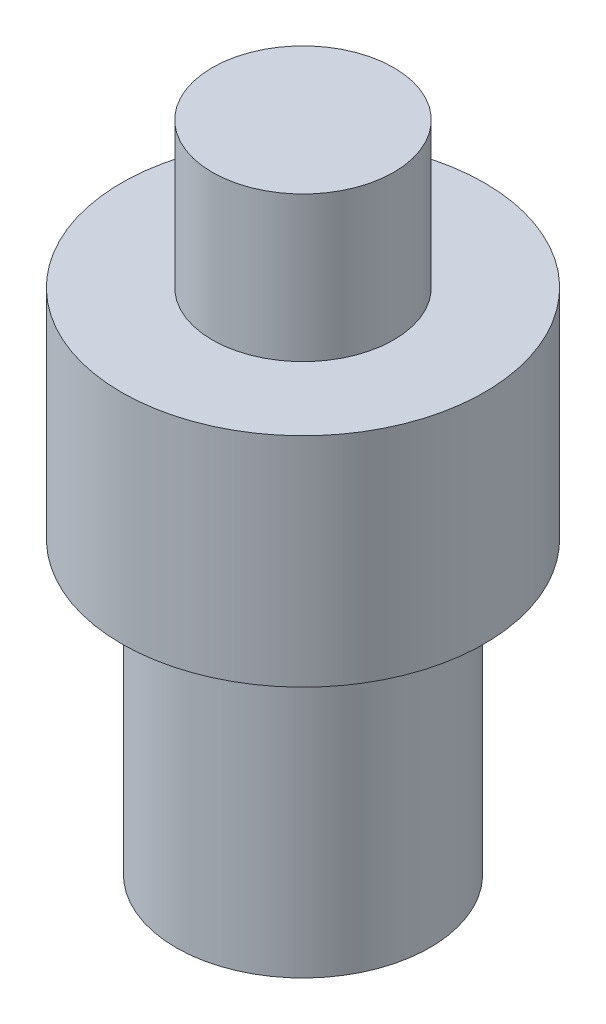
ISO-10303-21;
HEADER;
FILE_DESCRIPTION(('STEP AP214'),'2;1');
FILE_NAME('part.step','',(''),(''),'','','');
FILE_SCHEMA(('AUTOMOTIVE_DESIGN { 1 0 10303 214 1 1 1 1 }'));
ENDSEC;
DATA;
#1=APPLICATION_CONTEXT('core data for automotive mechanical design processes');
#2=APPLICATION_PROTOCOL_DEFINITION('international standard','automotive_design',2000,#1);
#3=PRODUCT_CONTEXT('',#1,'mechanical');
#4=PRODUCT('Part','Part','',(#3));
#5=PRODUCT_RELATED_PRODUCT_CATEGORY('part','',(#4));
#6=PRODUCT_DEFINITION_FORMATION('','',#4);
#7=PRODUCT_DEFINITION_CONTEXT('part definition',#1,'design');
#8=PRODUCT_DEFINITION('design','',#6,#7);
#9=PRODUCT_DEFINITION_SHAPE('','',#8);
#10=(LENGTH_UNIT() NAMED_UNIT(*) SI_UNIT(.MILLI.,.METRE.));
#11=(NAMED_UNIT(*) PLANE_ANGLE_UNIT() SI_UNIT($,.RADIAN.));
#12=(NAMED_UNIT(*) SI_UNIT($,.STERADIAN.) SOLID_ANGLE_UNIT());
#13=UNCERTAINTY_MEASURE_WITH_UNIT(LENGTH_MEASURE(1.E-05),#10,'distance_accuracy_value','');
#14=(GEOMETRIC_REPRESENTATION_CONTEXT(3) GLOBAL_UNCERTAINTY_ASSIGNED_CONTEXT((#13)) GLOBAL_UNIT_ASSIGNED_CONTEXT((#10,
#11,#12)) REPRESENTATION_CONTEXT('',''));
#15=CARTESIAN_POINT('',(0.,0.,0.));
#16=DIRECTION('',(0.,0.,1.));
#17=DIRECTION('',(1.,0.,0.));
#18=AXIS2_PLACEMENT_3D('',#15,#16,#17);
#19=CARTESIAN_POINT('',(0.,-45.,0.));
#20=DIRECTION('',(0.,-1.,0.));
#21=DIRECTION('',(0.,0.,-1.));
#22=AXIS2_PLACEMENT_3D('',#19,#20,#21);
#23=PLANE('',#22);
#24=CARTESIAN_POINT('',(0.,-45.,0.));
#25=DIRECTION('',(0.,-1.,0.));
#26=DIRECTION('',(0.,0.,-1.));
#27=AXIS2_PLACEMENT_3D('',#24,#25,#26);
#28=CIRCLE('',#27,17.5);
#29=CARTESIAN_POINT('',(0.,-45.,-17.5));
#30=VERTEX_POINT('',#29);
#31=EDGE_CURVE('E10',#30,#30,#28,.T.);
#32=ORIENTED_EDGE('',*,*,#31,.T.);
#33=EDGE_LOOP('',(#32));
#34=FACE_BOUND('',#33,.T.);
#35=ADVANCED_FACE('F49',(#34),#23,.T.);
#36=CARTESIAN_POINT('',(0.,-45.,0.));
#37=DIRECTION('',(0.,-1.,0.));
#38=DIRECTION('',(0.,0.,-1.));
#39=AXIS2_PLACEMENT_3D('',#36,#37,#38);
#40=CYLINDRICAL_SURFACE('',#39,17.5);
#41=CARTESIAN_POINT('',(0.,-5.,0.));
#42=DIRECTION('',(0.,-1.,0.));
#43=DIRECTION('',(0.,0.,-1.));
#44=AXIS2_PLACEMENT_3D('',#41,#42,#43);
#45=CIRCLE('',#44,17.5);
#46=CARTESIAN_POINT('',(0.,-5.,-17.5));
#47=VERTEX_POINT('',#46);
#48=EDGE_CURVE('E57',#47,#47,#45,.T.);
#49=ORIENTED_EDGE('',*,*,#48,.T.);
#50=EDGE_LOOP('',(#49));
#51=FACE_BOUND('',#50,.T.);
#52=ORIENTED_EDGE('',*,*,#31,.F.);
#53=EDGE_LOOP('',(#52));
#54=FACE_BOUND('',#53,.T.);
#55=ADVANCED_FACE('F94',(#51,#54),#40,.T.);
#56=CARTESIAN_POINT('',(17.5,-5.,0.));
#57=DIRECTION('',(0.,-1.,0.));
#58=DIRECTION('',(0.,0.,-1.));
#59=AXIS2_PLACEMENT_3D('',#56,#57,#58);
#60=PLANE('',#59);
#61=CARTESIAN_POINT('',(0.,-5.,0.));
#62=DIRECTION('',(0.,-1.,0.));
#63=DIRECTION('',(0.,0.,-1.));
#64=AXIS2_PLACEMENT_3D('',#61,#62,#63);
#65=CIRCLE('',#64,25.);
#66=CARTESIAN_POINT('',(0.,-5.,-25.));
#67=VERTEX_POINT('',#66);
#68=EDGE_CURVE('E64',#67,#67,#65,.T.);
#69=ORIENTED_EDGE('',*,*,#68,.T.);
#70=EDGE_LOOP('',(#69));
#71=FACE_BOUND('',#70,.T.);
#72=ORIENTED_EDGE('',*,*,#48,.F.);
#73=EDGE_LOOP('',(#72));
#74=FACE_BOUND('',#73,.T.);
#75=ADVANCED_FACE('F97',(#71,#74),#60,.T.);
#76=CARTESIAN_POINT('',(0.,-45.,0.));
#77=DIRECTION('',(0.,-1.,0.));
#78=DIRECTION('',(0.,0.,-1.));
#79=AXIS2_PLACEMENT_3D('',#76,#77,#78);
#80=CYLINDRICAL_SURFACE('',#79,25.);
#81=CARTESIAN_POINT('',(0.,25.,0.));
#82=DIRECTION('',(0.,-1.,0.));
#83=DIRECTION('',(0.,0.,-1.));
#84=AXIS2_PLACEMENT_3D('',#81,#82,#83);
#85=CIRCLE('',#84,25.);
#86=CARTESIAN_POINT('',(0.,25.,-25.));
#87=VERTEX_POINT('',#86);
#88=EDGE_CURVE('E69',#87,#87,#85,.T.);
#89=ORIENTED_EDGE('',*,*,#88,.T.);
#90=EDGE_LOOP('',(#89));
#91=FACE_BOUND('',#90,.T.);
#92=ORIENTED_EDGE('',*,*,#68,.F.);
#93=EDGE_LOOP('',(#92));
#94=FACE_BOUND('',#93,.T.);
#95=ADVANCED_FACE('F100',(#91,#94),#80,.T.);
#96=CARTESIAN_POINT('',(25.,25.,0.));
#97=DIRECTION('',(0.,1.,0.));
#98=DIRECTION('',(0.,0.,1.));
#99=AXIS2_PLACEMENT_3D('',#96,#97,#98);
#100=PLANE('',#99);
#101=CARTESIAN_POINT('',(0.,25.,0.));
#102=DIRECTION('',(0.,-1.,0.));
#103=DIRECTION('',(0.,0.,-1.));
#104=AXIS2_PLACEMENT_3D('',#101,#102,#103);
#105=CIRCLE('',#104,12.5);
#106=CARTESIAN_POINT('',(0.,25.,-12.5));
#107=VERTEX_POINT('',#106);
#108=EDGE_CURVE('E75',#107,#107,#105,.T.);
#109=ORIENTED_EDGE('',*,*,#108,.T.);
#110=EDGE_LOOP('',(#109));
#111=FACE_BOUND('',#110,.T.);
#112=ORIENTED_EDGE('',*,*,#88,.F.);
#113=EDGE_LOOP('',(#112));
#114=FACE_BOUND('',#113,.T.);
#115=ADVANCED_FACE('F90',(#111,#114),#100,.T.);
#116=CARTESIAN_POINT('',(0.,-45.,0.));
#117=DIRECTION('',(0.,-1.,0.));
#118=DIRECTION('',(0.,0.,-1.));
#119=AXIS2_PLACEMENT_3D('',#116,#117,#118);
#120=CYLINDRICAL_SURFACE('',#119,12.5);
#121=CARTESIAN_POINT('',(0.,45.,0.));
#122=DIRECTION('',(0.,-1.,0.));
#123=DIRECTION('',(0.,0.,-1.));
#124=AXIS2_PLACEMENT_3D('',#121,#122,#123);
#125=CIRCLE('',#124,12.5);
#126=CARTESIAN_POINT('',(0.,45.,-12.5));
#127=VERTEX_POINT('',#126);
#128=EDGE_CURVE('E78',#127,#127,#125,.T.);
#129=ORIENTED_EDGE('',*,*,#128,.T.);
#130=EDGE_LOOP('',(#129));
#131=FACE_BOUND('',#130,.T.);
#132=ORIENTED_EDGE('',*,*,#108,.F.);
#133=EDGE_LOOP('',(#132));
#134=FACE_BOUND('',#133,.T.);
#135=ADVANCED_FACE('F82',(#131,#134),#120,.T.);
#136=CARTESIAN_POINT('',(12.5,45.,0.));
#137=DIRECTION('',(0.,1.,0.));
#138=DIRECTION('',(0.,0.,1.));
#139=AXIS2_PLACEMENT_3D('',#136,#137,#138);
#140=PLANE('',#139);
#141=ORIENTED_EDGE('',*,*,#128,.F.);
#142=EDGE_LOOP('',(#141));
#143=FACE_BOUND('',#142,.T.);
#144=ADVANCED_FACE('F85',(#143),#140,.T.);
#145=CLOSED_SHELL('',(#35,#55,#75,#95,#115,#135,#144));
#146=MANIFOLD_SOLID_BREP('B2',#145);
#147=ADVANCED_BREP_SHAPE_REPRESENTATION('',(#18,#146),#14);
#148=SHAPE_DEFINITION_REPRESENTATION(#9,#147);
ENDSEC;
END-ISO-10303-21;
